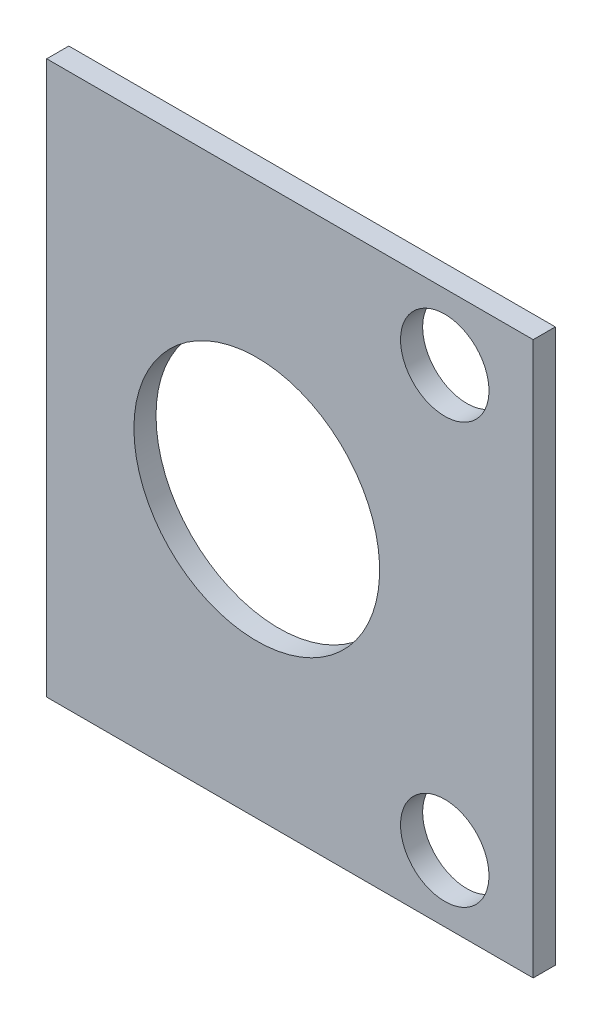
ISO-10303-21;
HEADER;
FILE_DESCRIPTION(('STEP AP214'),'2;1');
FILE_NAME('part.step','',(''),(''),'','','');
FILE_SCHEMA(('AUTOMOTIVE_DESIGN { 1 0 10303 214 1 1 1 1 }'));
ENDSEC;
DATA;
#1=APPLICATION_CONTEXT('core data for automotive mechanical design processes');
#2=APPLICATION_PROTOCOL_DEFINITION('international standard','automotive_design',2000,#1);
#3=PRODUCT_CONTEXT('',#1,'mechanical');
#4=PRODUCT('Part','Part','',(#3));
#5=PRODUCT_RELATED_PRODUCT_CATEGORY('part','',(#4));
#6=PRODUCT_DEFINITION_FORMATION('','',#4);
#7=PRODUCT_DEFINITION_CONTEXT('part definition',#1,'design');
#8=PRODUCT_DEFINITION('design','',#6,#7);
#9=PRODUCT_DEFINITION_SHAPE('','',#8);
#10=(LENGTH_UNIT() NAMED_UNIT(*) SI_UNIT(.MILLI.,.METRE.));
#11=(NAMED_UNIT(*) PLANE_ANGLE_UNIT() SI_UNIT($,.RADIAN.));
#12=(NAMED_UNIT(*) SI_UNIT($,.STERADIAN.) SOLID_ANGLE_UNIT());
#13=UNCERTAINTY_MEASURE_WITH_UNIT(LENGTH_MEASURE(1.E-05),#10,'distance_accuracy_value','');
#14=(GEOMETRIC_REPRESENTATION_CONTEXT(3) GLOBAL_UNCERTAINTY_ASSIGNED_CONTEXT((#13)) GLOBAL_UNIT_ASSIGNED_CONTEXT((#10,
#11,#12)) REPRESENTATION_CONTEXT('',''));
#15=CARTESIAN_POINT('',(0.,0.,0.));
#16=DIRECTION('',(0.,0.,1.));
#17=DIRECTION('',(1.,0.,0.));
#18=AXIS2_PLACEMENT_3D('',#15,#16,#17);
#19=CARTESIAN_POINT('',(0.,0.,-1.));
#20=DIRECTION('',(0.,0.,1.));
#21=DIRECTION('',(1.,0.,0.));
#22=AXIS2_PLACEMENT_3D('',#19,#20,#21);
#23=PLANE('',#22);
#24=CARTESIAN_POINT('',(-3.,0.,-1.));
#25=DIRECTION('',(0.,0.,-1.));
#26=DIRECTION('',(-1.,0.,0.));
#27=AXIS2_PLACEMENT_3D('',#24,#25,#26);
#28=CIRCLE('',#27,11.1125);
#29=CARTESIAN_POINT('',(-14.1125,0.,-1.));
#30=VERTEX_POINT('',#29);
#31=EDGE_CURVE('E87',#30,#30,#28,.F.);
#32=ORIENTED_EDGE('',*,*,#31,.T.);
#33=EDGE_LOOP('',(#32));
#34=FACE_BOUND('',#33,.T.);
#35=CARTESIAN_POINT('',(14.,19.,-1.));
#36=DIRECTION('',(0.,0.,-1.));
#37=DIRECTION('',(-1.,0.,0.));
#38=AXIS2_PLACEMENT_3D('',#35,#36,#37);
#39=CIRCLE('',#38,4.);
#40=CARTESIAN_POINT('',(9.99999999999999,19.,-1.));
#41=VERTEX_POINT('',#40);
#42=EDGE_CURVE('E90',#41,#41,#39,.F.);
#43=ORIENTED_EDGE('',*,*,#42,.T.);
#44=EDGE_LOOP('',(#43));
#45=FACE_BOUND('',#44,.T.);
#46=CARTESIAN_POINT('',(14.,-19.,-1.));
#47=DIRECTION('',(0.,0.,-1.));
#48=DIRECTION('',(-1.,0.,0.));
#49=AXIS2_PLACEMENT_3D('',#46,#47,#48);
#50=CIRCLE('',#49,4.);
#51=CARTESIAN_POINT('',(9.99999999999999,-19.,-1.));
#52=VERTEX_POINT('',#51);
#53=EDGE_CURVE('E20',#52,#52,#50,.F.);
#54=ORIENTED_EDGE('',*,*,#53,.T.);
#55=EDGE_LOOP('',(#54));
#56=FACE_BOUND('',#55,.T.);
#57=DIRECTION('',(1.,0.,0.));
#58=VECTOR('',#57,1.);
#59=CARTESIAN_POINT('',(-22.,25.,-1.));
#60=LINE('',#59,#58);
#61=CARTESIAN_POINT('',(22.,25.,-1.));
#62=VERTEX_POINT('',#61);
#63=CARTESIAN_POINT('',(-22.,25.,-1.));
#64=VERTEX_POINT('',#63);
#65=EDGE_CURVE('E55',#62,#64,#60,.F.);
#66=ORIENTED_EDGE('',*,*,#65,.F.);
#67=DIRECTION('',(0.,1.,0.));
#68=VECTOR('',#67,1.);
#69=CARTESIAN_POINT('',(22.,25.,-1.));
#70=LINE('',#69,#68);
#71=CARTESIAN_POINT('',(22.,-25.,-1.));
#72=VERTEX_POINT('',#71);
#73=EDGE_CURVE('E60',#72,#62,#70,.T.);
#74=ORIENTED_EDGE('',*,*,#73,.F.);
#75=DIRECTION('',(1.,0.,0.));
#76=VECTOR('',#75,1.);
#77=CARTESIAN_POINT('',(22.,-25.,-1.));
#78=LINE('',#77,#76);
#79=CARTESIAN_POINT('',(-22.,-25.,-1.));
#80=VERTEX_POINT('',#79);
#81=EDGE_CURVE('E97',#80,#72,#78,.T.);
#82=ORIENTED_EDGE('',*,*,#81,.F.);
#83=DIRECTION('',(0.,1.,0.));
#84=VECTOR('',#83,1.);
#85=CARTESIAN_POINT('',(-22.,-25.,-1.));
#86=LINE('',#85,#84);
#87=EDGE_CURVE('E70',#64,#80,#86,.F.);
#88=ORIENTED_EDGE('',*,*,#87,.F.);
#89=EDGE_LOOP('',(#66,#74,#82,#88));
#90=FACE_BOUND('',#89,.T.);
#91=ADVANCED_FACE('F16',(#34,#45,#56,#90),#23,.F.);
#92=CARTESIAN_POINT('',(22.,25.,0.));
#93=DIRECTION('',(1.,0.,0.));
#94=DIRECTION('',(0.,0.,-1.));
#95=AXIS2_PLACEMENT_3D('',#92,#93,#94);
#96=PLANE('',#95);
#97=ORIENTED_EDGE('',*,*,#73,.T.);
#98=DIRECTION('',(0.,0.,1.));
#99=VECTOR('',#98,1.);
#100=CARTESIAN_POINT('',(22.,25.,0.));
#101=LINE('',#100,#99);
#102=CARTESIAN_POINT('',(22.,25.,1.));
#103=VERTEX_POINT('',#102);
#104=EDGE_CURVE('E62',#103,#62,#101,.F.);
#105=ORIENTED_EDGE('',*,*,#104,.F.);
#106=DIRECTION('',(0.,1.,0.));
#107=VECTOR('',#106,1.);
#108=CARTESIAN_POINT('',(22.,0.,1.));
#109=LINE('',#108,#107);
#110=CARTESIAN_POINT('',(22.,-25.,1.));
#111=VERTEX_POINT('',#110);
#112=EDGE_CURVE('E89',#111,#103,#109,.T.);
#113=ORIENTED_EDGE('',*,*,#112,.F.);
#114=DIRECTION('',(0.,0.,-1.));
#115=VECTOR('',#114,1.);
#116=CARTESIAN_POINT('',(22.,-25.,0.));
#117=LINE('',#116,#115);
#118=EDGE_CURVE('E65',#72,#111,#117,.F.);
#119=ORIENTED_EDGE('',*,*,#118,.F.);
#120=EDGE_LOOP('',(#97,#105,#113,#119));
#121=FACE_BOUND('',#120,.T.);
#122=ADVANCED_FACE('F61',(#121),#96,.T.);
#123=CARTESIAN_POINT('',(-22.,25.,0.));
#124=DIRECTION('',(0.,1.,0.));
#125=DIRECTION('',(0.,0.,1.));
#126=AXIS2_PLACEMENT_3D('',#123,#124,#125);
#127=PLANE('',#126);
#128=ORIENTED_EDGE('',*,*,#65,.T.);
#129=DIRECTION('',(0.,0.,1.));
#130=VECTOR('',#129,1.);
#131=CARTESIAN_POINT('',(-22.,25.,0.));
#132=LINE('',#131,#130);
#133=CARTESIAN_POINT('',(-22.,25.,1.));
#134=VERTEX_POINT('',#133);
#135=EDGE_CURVE('E72',#134,#64,#132,.F.);
#136=ORIENTED_EDGE('',*,*,#135,.F.);
#137=DIRECTION('',(1.,0.,0.));
#138=VECTOR('',#137,1.);
#139=CARTESIAN_POINT('',(0.,25.,1.));
#140=LINE('',#139,#138);
#141=EDGE_CURVE('E76',#103,#134,#140,.F.);
#142=ORIENTED_EDGE('',*,*,#141,.F.);
#143=ORIENTED_EDGE('',*,*,#104,.T.);
#144=EDGE_LOOP('',(#128,#136,#142,#143));
#145=FACE_BOUND('',#144,.T.);
#146=ADVANCED_FACE('F74',(#145),#127,.T.);
#147=CARTESIAN_POINT('',(-22.,-25.,0.));
#148=DIRECTION('',(-1.,0.,0.));
#149=DIRECTION('',(0.,0.,1.));
#150=AXIS2_PLACEMENT_3D('',#147,#148,#149);
#151=PLANE('',#150);
#152=ORIENTED_EDGE('',*,*,#87,.T.);
#153=DIRECTION('',(0.,0.,-1.));
#154=VECTOR('',#153,1.);
#155=CARTESIAN_POINT('',(-22.,-25.,0.));
#156=LINE('',#155,#154);
#157=CARTESIAN_POINT('',(-22.,-25.,1.));
#158=VERTEX_POINT('',#157);
#159=EDGE_CURVE('E35',#158,#80,#156,.T.);
#160=ORIENTED_EDGE('',*,*,#159,.F.);
#161=DIRECTION('',(0.,1.,0.));
#162=VECTOR('',#161,1.);
#163=CARTESIAN_POINT('',(-22.,0.,1.));
#164=LINE('',#163,#162);
#165=EDGE_CURVE('E108',#134,#158,#164,.F.);
#166=ORIENTED_EDGE('',*,*,#165,.F.);
#167=ORIENTED_EDGE('',*,*,#135,.T.);
#168=EDGE_LOOP('',(#152,#160,#166,#167));
#169=FACE_BOUND('',#168,.T.);
#170=ADVANCED_FACE('F106',(#169),#151,.T.);
#171=CARTESIAN_POINT('',(22.,-25.,0.));
#172=DIRECTION('',(0.,-1.,0.));
#173=DIRECTION('',(0.,0.,-1.));
#174=AXIS2_PLACEMENT_3D('',#171,#172,#173);
#175=PLANE('',#174);
#176=ORIENTED_EDGE('',*,*,#81,.T.);
#177=ORIENTED_EDGE('',*,*,#118,.T.);
#178=DIRECTION('',(1.,0.,0.));
#179=VECTOR('',#178,1.);
#180=CARTESIAN_POINT('',(0.,-25.,1.));
#181=LINE('',#180,#179);
#182=EDGE_CURVE('E86',#158,#111,#181,.T.);
#183=ORIENTED_EDGE('',*,*,#182,.F.);
#184=ORIENTED_EDGE('',*,*,#159,.T.);
#185=EDGE_LOOP('',(#176,#177,#183,#184));
#186=FACE_BOUND('',#185,.T.);
#187=ADVANCED_FACE('F113',(#186),#175,.T.);
#188=CARTESIAN_POINT('',(14.,-19.,1.));
#189=DIRECTION('',(0.,0.,-1.));
#190=DIRECTION('',(-1.,0.,0.));
#191=AXIS2_PLACEMENT_3D('',#188,#189,#190);
#192=CYLINDRICAL_SURFACE('',#191,4.);
#193=CARTESIAN_POINT('',(14.,-19.,1.));
#194=DIRECTION('',(0.,0.,-1.));
#195=DIRECTION('',(-1.,0.,0.));
#196=AXIS2_PLACEMENT_3D('',#193,#194,#195);
#197=CIRCLE('',#196,4.);
#198=CARTESIAN_POINT('',(9.99999999999999,-19.,1.));
#199=VERTEX_POINT('',#198);
#200=EDGE_CURVE('E83',#199,#199,#197,.T.);
#201=ORIENTED_EDGE('',*,*,#200,.F.);
#202=EDGE_LOOP('',(#201));
#203=FACE_BOUND('',#202,.T.);
#204=ORIENTED_EDGE('',*,*,#53,.F.);
#205=EDGE_LOOP('',(#204));
#206=FACE_BOUND('',#205,.T.);
#207=ADVANCED_FACE('F115',(#203,#206),#192,.F.);
#208=CARTESIAN_POINT('',(14.,19.,1.));
#209=DIRECTION('',(0.,0.,-1.));
#210=DIRECTION('',(-1.,0.,0.));
#211=AXIS2_PLACEMENT_3D('',#208,#209,#210);
#212=CYLINDRICAL_SURFACE('',#211,4.);
#213=CARTESIAN_POINT('',(14.,19.,1.));
#214=DIRECTION('',(0.,0.,-1.));
#215=DIRECTION('',(-1.,0.,0.));
#216=AXIS2_PLACEMENT_3D('',#213,#214,#215);
#217=CIRCLE('',#216,4.);
#218=CARTESIAN_POINT('',(9.99999999999999,19.,1.));
#219=VERTEX_POINT('',#218);
#220=EDGE_CURVE('E26',#219,#219,#217,.T.);
#221=ORIENTED_EDGE('',*,*,#220,.F.);
#222=EDGE_LOOP('',(#221));
#223=FACE_BOUND('',#222,.T.);
#224=ORIENTED_EDGE('',*,*,#42,.F.);
#225=EDGE_LOOP('',(#224));
#226=FACE_BOUND('',#225,.T.);
#227=ADVANCED_FACE('F122',(#223,#226),#212,.F.);
#228=CARTESIAN_POINT('',(-3.,0.,1.));
#229=DIRECTION('',(0.,0.,-1.));
#230=DIRECTION('',(-1.,0.,0.));
#231=AXIS2_PLACEMENT_3D('',#228,#229,#230);
#232=CYLINDRICAL_SURFACE('',#231,11.1125);
#233=CARTESIAN_POINT('',(-3.,0.,1.));
#234=DIRECTION('',(0.,0.,-1.));
#235=DIRECTION('',(-1.,0.,0.));
#236=AXIS2_PLACEMENT_3D('',#233,#234,#235);
#237=CIRCLE('',#236,11.1125);
#238=CARTESIAN_POINT('',(-14.1125,0.,1.));
#239=VERTEX_POINT('',#238);
#240=EDGE_CURVE('E10',#239,#239,#237,.T.);
#241=ORIENTED_EDGE('',*,*,#240,.F.);
#242=EDGE_LOOP('',(#241));
#243=FACE_BOUND('',#242,.T.);
#244=ORIENTED_EDGE('',*,*,#31,.F.);
#245=EDGE_LOOP('',(#244));
#246=FACE_BOUND('',#245,.T.);
#247=ADVANCED_FACE('F18',(#243,#246),#232,.F.);
#248=CARTESIAN_POINT('',(0.,0.,1.));
#249=DIRECTION('',(0.,0.,1.));
#250=DIRECTION('',(1.,0.,0.));
#251=AXIS2_PLACEMENT_3D('',#248,#249,#250);
#252=PLANE('',#251);
#253=ORIENTED_EDGE('',*,*,#240,.T.);
#254=EDGE_LOOP('',(#253));
#255=FACE_BOUND('',#254,.T.);
#256=ORIENTED_EDGE('',*,*,#220,.T.);
#257=EDGE_LOOP('',(#256));
#258=FACE_BOUND('',#257,.T.);
#259=ORIENTED_EDGE('',*,*,#200,.T.);
#260=EDGE_LOOP('',(#259));
#261=FACE_BOUND('',#260,.T.);
#262=ORIENTED_EDGE('',*,*,#165,.T.);
#263=ORIENTED_EDGE('',*,*,#182,.T.);
#264=ORIENTED_EDGE('',*,*,#112,.T.);
#265=ORIENTED_EDGE('',*,*,#141,.T.);
#266=EDGE_LOOP('',(#262,#263,#264,#265));
#267=FACE_BOUND('',#266,.T.);
#268=ADVANCED_FACE('F111',(#255,#258,#261,#267),#252,.T.);
#269=CLOSED_SHELL('',(#91,#122,#146,#170,#187,#207,#227,#247,#268));
#270=MANIFOLD_SOLID_BREP('B1',#269);
#271=ADVANCED_BREP_SHAPE_REPRESENTATION('',(#18,#270),#14);
#272=SHAPE_DEFINITION_REPRESENTATION(#9,#271);
ENDSEC;
END-ISO-10303-21;
